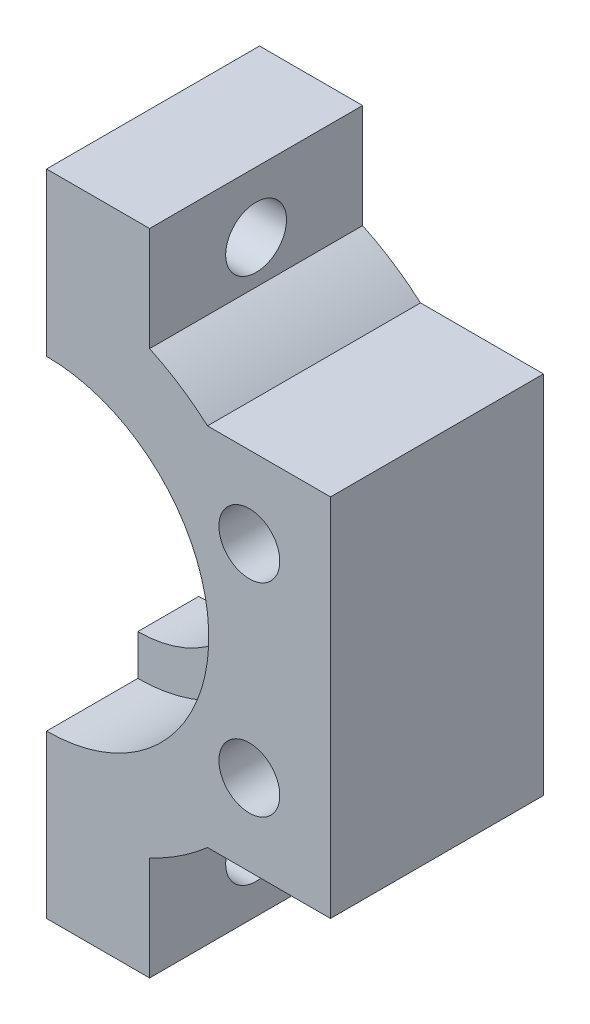
ISO-10303-21;
HEADER;
FILE_DESCRIPTION(('STEP AP214'),'2;1');
FILE_NAME('part.step','',(''),(''),'','','');
FILE_SCHEMA(('AUTOMOTIVE_DESIGN { 1 0 10303 214 1 1 1 1 }'));
ENDSEC;
DATA;
#1=APPLICATION_CONTEXT('core data for automotive mechanical design processes');
#2=APPLICATION_PROTOCOL_DEFINITION('international standard','automotive_design',2000,#1);
#3=PRODUCT_CONTEXT('',#1,'mechanical');
#4=PRODUCT('Part','Part','',(#3));
#5=PRODUCT_RELATED_PRODUCT_CATEGORY('part','',(#4));
#6=PRODUCT_DEFINITION_FORMATION('','',#4);
#7=PRODUCT_DEFINITION_CONTEXT('part definition',#1,'design');
#8=PRODUCT_DEFINITION('design','',#6,#7);
#9=PRODUCT_DEFINITION_SHAPE('','',#8);
#10=(LENGTH_UNIT() NAMED_UNIT(*) SI_UNIT(.MILLI.,.METRE.));
#11=(NAMED_UNIT(*) PLANE_ANGLE_UNIT() SI_UNIT($,.RADIAN.));
#12=(NAMED_UNIT(*) SI_UNIT($,.STERADIAN.) SOLID_ANGLE_UNIT());
#13=UNCERTAINTY_MEASURE_WITH_UNIT(LENGTH_MEASURE(1.E-05),#10,'distance_accuracy_value','');
#14=(GEOMETRIC_REPRESENTATION_CONTEXT(3) GLOBAL_UNCERTAINTY_ASSIGNED_CONTEXT((#13)) GLOBAL_UNIT_ASSIGNED_CONTEXT((#10,
#11,#12)) REPRESENTATION_CONTEXT('',''));
#15=CARTESIAN_POINT('',(0.,0.,0.));
#16=DIRECTION('',(0.,0.,1.));
#17=DIRECTION('',(1.,0.,0.));
#18=AXIS2_PLACEMENT_3D('',#15,#16,#17);
#19=CARTESIAN_POINT('',(0.,0.,10.5));
#20=DIRECTION('',(0.,0.,-1.));
#21=DIRECTION('',(-1.,0.,0.));
#22=AXIS2_PLACEMENT_3D('',#19,#20,#21);
#23=CYLINDRICAL_SURFACE('',#22,6.);
#24=CARTESIAN_POINT('',(0.,0.,3.));
#25=DIRECTION('',(0.,0.,-1.));
#26=DIRECTION('',(-1.,0.,0.));
#27=AXIS2_PLACEMENT_3D('',#24,#25,#26);
#28=CIRCLE('',#27,6.);
#29=CARTESIAN_POINT('',(0.,-6.,3.));
#30=VERTEX_POINT('',#29);
#31=CARTESIAN_POINT('',(0.,6.,3.));
#32=VERTEX_POINT('',#31);
#33=EDGE_CURVE('E243',#30,#32,#28,.F.);
#34=ORIENTED_EDGE('',*,*,#33,.F.);
#35=DIRECTION('',(0.,0.,-1.));
#36=VECTOR('',#35,1.);
#37=CARTESIAN_POINT('',(0.,-6.,10.5));
#38=LINE('',#37,#36);
#39=CARTESIAN_POINT('',(0.,-6.,6.));
#40=VERTEX_POINT('',#39);
#41=EDGE_CURVE('E230',#40,#30,#38,.T.);
#42=ORIENTED_EDGE('',*,*,#41,.F.);
#43=CARTESIAN_POINT('',(0.,0.,6.));
#44=DIRECTION('',(0.,0.,1.));
#45=DIRECTION('',(1.,0.,0.));
#46=AXIS2_PLACEMENT_3D('',#43,#44,#45);
#47=CIRCLE('',#46,6.);
#48=CARTESIAN_POINT('',(0.,6.,6.));
#49=VERTEX_POINT('',#48);
#50=EDGE_CURVE('E60',#49,#40,#47,.F.);
#51=ORIENTED_EDGE('',*,*,#50,.F.);
#52=DIRECTION('',(0.,0.,-1.));
#53=VECTOR('',#52,1.);
#54=CARTESIAN_POINT('',(0.,6.,10.5));
#55=LINE('',#54,#53);
#56=EDGE_CURVE('E233',#49,#32,#55,.T.);
#57=ORIENTED_EDGE('',*,*,#56,.T.);
#58=EDGE_LOOP('',(#34,#42,#51,#57));
#59=FACE_BOUND('',#58,.T.);
#60=ADVANCED_FACE('F37',(#59),#23,.F.);
#61=CARTESIAN_POINT('',(0.,0.,10.5));
#62=DIRECTION('',(0.,0.,1.));
#63=DIRECTION('',(1.,0.,0.));
#64=AXIS2_PLACEMENT_3D('',#61,#62,#63);
#65=PLANE('',#64);
#66=CARTESIAN_POINT('',(0.,0.,10.5));
#67=DIRECTION('',(0.,0.,1.));
#68=DIRECTION('',(1.,0.,0.));
#69=AXIS2_PLACEMENT_3D('',#66,#67,#68);
#70=CIRCLE('',#69,8.);
#71=CARTESIAN_POINT('',(0.,-8.,10.5));
#72=VERTEX_POINT('',#71);
#73=CARTESIAN_POINT('',(0.,8.,10.5));
#74=VERTEX_POINT('',#73);
#75=EDGE_CURVE('E261',#72,#74,#70,.T.);
#76=ORIENTED_EDGE('',*,*,#75,.F.);
#77=DIRECTION('',(0.,-1.,0.));
#78=VECTOR('',#77,1.);
#79=CARTESIAN_POINT('',(0.,-6.,10.5));
#80=LINE('',#79,#78);
#81=CARTESIAN_POINT('',(0.,-16.,10.5));
#82=VERTEX_POINT('',#81);
#83=EDGE_CURVE('E283',#72,#82,#80,.T.);
#84=ORIENTED_EDGE('',*,*,#83,.T.);
#85=DIRECTION('',(1.,0.,0.));
#86=VECTOR('',#85,1.);
#87=CARTESIAN_POINT('',(5.08182667726296,-16.,10.5));
#88=LINE('',#87,#86);
#89=CARTESIAN_POINT('',(5.08182667726296,-16.,10.5));
#90=VERTEX_POINT('',#89);
#91=EDGE_CURVE('E285',#82,#90,#88,.T.);
#92=ORIENTED_EDGE('',*,*,#91,.T.);
#93=DIRECTION('',(0.,1.,0.));
#94=VECTOR('',#93,1.);
#95=CARTESIAN_POINT('',(5.08182667726297,-10.8708342652374,10.5));
#96=LINE('',#95,#94);
#97=CARTESIAN_POINT('',(5.08182667726297,-10.8708342652374,10.5));
#98=VERTEX_POINT('',#97);
#99=EDGE_CURVE('E287',#90,#98,#96,.T.);
#100=ORIENTED_EDGE('',*,*,#99,.T.);
#101=CARTESIAN_POINT('',(0.,0.,10.5));
#102=DIRECTION('',(0.,0.,1.));
#103=DIRECTION('',(1.,0.,0.));
#104=AXIS2_PLACEMENT_3D('',#101,#102,#103);
#105=CIRCLE('',#104,12.);
#106=CARTESIAN_POINT('',(7.93725393319378,-9.,10.5));
#107=VERTEX_POINT('',#106);
#108=EDGE_CURVE('E289',#98,#107,#105,.T.);
#109=ORIENTED_EDGE('',*,*,#108,.T.);
#110=DIRECTION('',(1.,0.,0.));
#111=VECTOR('',#110,1.);
#112=CARTESIAN_POINT('',(14.,-9.,10.5));
#113=LINE('',#112,#111);
#114=CARTESIAN_POINT('',(14.,-9.,10.5));
#115=VERTEX_POINT('',#114);
#116=EDGE_CURVE('E291',#107,#115,#113,.T.);
#117=ORIENTED_EDGE('',*,*,#116,.T.);
#118=DIRECTION('',(0.,1.,0.));
#119=VECTOR('',#118,1.);
#120=CARTESIAN_POINT('',(14.,9.,10.5));
#121=LINE('',#120,#119);
#122=CARTESIAN_POINT('',(14.,9.,10.5));
#123=VERTEX_POINT('',#122);
#124=EDGE_CURVE('E293',#115,#123,#121,.T.);
#125=ORIENTED_EDGE('',*,*,#124,.T.);
#126=DIRECTION('',(-1.,0.,0.));
#127=VECTOR('',#126,1.);
#128=CARTESIAN_POINT('',(7.93725393319378,9.,10.5));
#129=LINE('',#128,#127);
#130=CARTESIAN_POINT('',(7.93725393319378,9.,10.5));
#131=VERTEX_POINT('',#130);
#132=EDGE_CURVE('E295',#123,#131,#129,.T.);
#133=ORIENTED_EDGE('',*,*,#132,.T.);
#134=CARTESIAN_POINT('',(0.,0.,10.5));
#135=DIRECTION('',(0.,0.,1.));
#136=DIRECTION('',(1.,0.,0.));
#137=AXIS2_PLACEMENT_3D('',#134,#135,#136);
#138=CIRCLE('',#137,12.);
#139=CARTESIAN_POINT('',(5.08182667726297,10.8708342652373,10.5));
#140=VERTEX_POINT('',#139);
#141=EDGE_CURVE('E297',#131,#140,#138,.T.);
#142=ORIENTED_EDGE('',*,*,#141,.T.);
#143=DIRECTION('',(0.,1.,0.));
#144=VECTOR('',#143,1.);
#145=CARTESIAN_POINT('',(5.08182667726296,16.,10.5));
#146=LINE('',#145,#144);
#147=CARTESIAN_POINT('',(5.08182667726296,16.,10.5));
#148=VERTEX_POINT('',#147);
#149=EDGE_CURVE('E298',#140,#148,#146,.T.);
#150=ORIENTED_EDGE('',*,*,#149,.T.);
#151=DIRECTION('',(-1.,0.,0.));
#152=VECTOR('',#151,1.);
#153=CARTESIAN_POINT('',(0.,16.,10.5));
#154=LINE('',#153,#152);
#155=CARTESIAN_POINT('',(0.,16.,10.5));
#156=VERTEX_POINT('',#155);
#157=EDGE_CURVE('E181',#148,#156,#154,.T.);
#158=ORIENTED_EDGE('',*,*,#157,.T.);
#159=DIRECTION('',(0.,-1.,0.));
#160=VECTOR('',#159,1.);
#161=CARTESIAN_POINT('',(0.,9.,10.5));
#162=LINE('',#161,#160);
#163=EDGE_CURVE('E201',#156,#74,#162,.T.);
#164=ORIENTED_EDGE('',*,*,#163,.T.);
#165=EDGE_LOOP('',(#76,#84,#92,#100,#109,#117,#125,#133,#142,#150,#158,#164));
#166=FACE_BOUND('',#165,.T.);
#167=CARTESIAN_POINT('',(10.,5.,10.5));
#168=DIRECTION('',(0.,0.,1.));
#169=DIRECTION('',(1.,0.,0.));
#170=AXIS2_PLACEMENT_3D('',#167,#168,#169);
#171=CIRCLE('',#170,1.5);
#172=CARTESIAN_POINT('',(8.5,5.,10.5));
#173=VERTEX_POINT('',#172);
#174=EDGE_CURVE('E173',#173,#173,#171,.T.);
#175=ORIENTED_EDGE('',*,*,#174,.F.);
#176=EDGE_LOOP('',(#175));
#177=FACE_BOUND('',#176,.T.);
#178=CARTESIAN_POINT('',(10.,-5.,10.5));
#179=DIRECTION('',(0.,0.,1.));
#180=DIRECTION('',(1.,0.,0.));
#181=AXIS2_PLACEMENT_3D('',#178,#179,#180);
#182=CIRCLE('',#181,1.5);
#183=CARTESIAN_POINT('',(8.5,-5.,10.5));
#184=VERTEX_POINT('',#183);
#185=EDGE_CURVE('E274',#184,#184,#182,.T.);
#186=ORIENTED_EDGE('',*,*,#185,.F.);
#187=EDGE_LOOP('',(#186));
#188=FACE_BOUND('',#187,.T.);
#189=ADVANCED_FACE('F303',(#166,#177,#188),#65,.T.);
#190=CARTESIAN_POINT('',(0.,0.,0.));
#191=DIRECTION('',(0.,0.,1.));
#192=DIRECTION('',(1.,0.,0.));
#193=AXIS2_PLACEMENT_3D('',#190,#191,#192);
#194=PLANE('',#193);
#195=DIRECTION('',(0.,-1.,0.));
#196=VECTOR('',#195,1.);
#197=CARTESIAN_POINT('',(0.,-16.,0.));
#198=LINE('',#197,#196);
#199=CARTESIAN_POINT('',(0.,-8.,0.));
#200=VERTEX_POINT('',#199);
#201=CARTESIAN_POINT('',(0.,-16.,0.));
#202=VERTEX_POINT('',#201);
#203=EDGE_CURVE('E167',#200,#202,#198,.T.);
#204=ORIENTED_EDGE('',*,*,#203,.F.);
#205=CARTESIAN_POINT('',(0.,0.,0.));
#206=DIRECTION('',(0.,0.,-1.));
#207=DIRECTION('',(-1.,0.,0.));
#208=AXIS2_PLACEMENT_3D('',#205,#206,#207);
#209=CIRCLE('',#208,8.);
#210=CARTESIAN_POINT('',(0.,8.,0.));
#211=VERTEX_POINT('',#210);
#212=EDGE_CURVE('E152',#211,#200,#209,.T.);
#213=ORIENTED_EDGE('',*,*,#212,.F.);
#214=DIRECTION('',(0.,-1.,0.));
#215=VECTOR('',#214,1.);
#216=CARTESIAN_POINT('',(0.,9.,0.));
#217=LINE('',#216,#215);
#218=CARTESIAN_POINT('',(0.,16.,0.));
#219=VERTEX_POINT('',#218);
#220=EDGE_CURVE('E164',#219,#211,#217,.T.);
#221=ORIENTED_EDGE('',*,*,#220,.F.);
#222=DIRECTION('',(-1.,0.,0.));
#223=VECTOR('',#222,1.);
#224=CARTESIAN_POINT('',(0.,16.,0.));
#225=LINE('',#224,#223);
#226=CARTESIAN_POINT('',(5.08182667726296,16.,0.));
#227=VERTEX_POINT('',#226);
#228=EDGE_CURVE('E199',#227,#219,#225,.T.);
#229=ORIENTED_EDGE('',*,*,#228,.F.);
#230=DIRECTION('',(0.,1.,0.));
#231=VECTOR('',#230,1.);
#232=CARTESIAN_POINT('',(5.08182667726296,16.,0.));
#233=LINE('',#232,#231);
#234=CARTESIAN_POINT('',(5.08182667726297,10.8708342652373,0.));
#235=VERTEX_POINT('',#234);
#236=EDGE_CURVE('E197',#235,#227,#233,.T.);
#237=ORIENTED_EDGE('',*,*,#236,.F.);
#238=CARTESIAN_POINT('',(0.,0.,0.));
#239=DIRECTION('',(0.,0.,1.));
#240=DIRECTION('',(1.,0.,0.));
#241=AXIS2_PLACEMENT_3D('',#238,#239,#240);
#242=CIRCLE('',#241,12.);
#243=CARTESIAN_POINT('',(7.93725393319378,9.,0.));
#244=VERTEX_POINT('',#243);
#245=EDGE_CURVE('E195',#244,#235,#242,.T.);
#246=ORIENTED_EDGE('',*,*,#245,.F.);
#247=DIRECTION('',(-1.,0.,0.));
#248=VECTOR('',#247,1.);
#249=CARTESIAN_POINT('',(7.93725393319378,9.,0.));
#250=LINE('',#249,#248);
#251=CARTESIAN_POINT('',(14.,9.,0.));
#252=VERTEX_POINT('',#251);
#253=EDGE_CURVE('E193',#252,#244,#250,.T.);
#254=ORIENTED_EDGE('',*,*,#253,.F.);
#255=DIRECTION('',(0.,1.,0.));
#256=VECTOR('',#255,1.);
#257=CARTESIAN_POINT('',(14.,9.,0.));
#258=LINE('',#257,#256);
#259=CARTESIAN_POINT('',(14.,-9.,0.));
#260=VERTEX_POINT('',#259);
#261=EDGE_CURVE('E191',#260,#252,#258,.T.);
#262=ORIENTED_EDGE('',*,*,#261,.F.);
#263=DIRECTION('',(1.,0.,0.));
#264=VECTOR('',#263,1.);
#265=CARTESIAN_POINT('',(14.,-9.,0.));
#266=LINE('',#265,#264);
#267=CARTESIAN_POINT('',(7.93725393319378,-9.,0.));
#268=VERTEX_POINT('',#267);
#269=EDGE_CURVE('E189',#268,#260,#266,.T.);
#270=ORIENTED_EDGE('',*,*,#269,.F.);
#271=CARTESIAN_POINT('',(0.,0.,0.));
#272=DIRECTION('',(0.,0.,1.));
#273=DIRECTION('',(1.,0.,0.));
#274=AXIS2_PLACEMENT_3D('',#271,#272,#273);
#275=CIRCLE('',#274,12.);
#276=CARTESIAN_POINT('',(5.08182667726297,-10.8708342652374,0.));
#277=VERTEX_POINT('',#276);
#278=EDGE_CURVE('E187',#277,#268,#275,.T.);
#279=ORIENTED_EDGE('',*,*,#278,.F.);
#280=DIRECTION('',(0.,1.,0.));
#281=VECTOR('',#280,1.);
#282=CARTESIAN_POINT('',(5.08182667726297,-10.8708342652374,0.));
#283=LINE('',#282,#281);
#284=CARTESIAN_POINT('',(5.08182667726296,-16.,0.));
#285=VERTEX_POINT('',#284);
#286=EDGE_CURVE('E185',#285,#277,#283,.T.);
#287=ORIENTED_EDGE('',*,*,#286,.F.);
#288=DIRECTION('',(1.,0.,0.));
#289=VECTOR('',#288,1.);
#290=CARTESIAN_POINT('',(5.08182667726296,-16.,0.));
#291=LINE('',#290,#289);
#292=EDGE_CURVE('E175',#202,#285,#291,.T.);
#293=ORIENTED_EDGE('',*,*,#292,.F.);
#294=EDGE_LOOP('',(#204,#213,#221,#229,#237,#246,#254,#262,#270,#279,#287,#293));
#295=FACE_BOUND('',#294,.T.);
#296=CARTESIAN_POINT('',(10.,5.,0.));
#297=DIRECTION('',(0.,0.,1.));
#298=DIRECTION('',(1.,0.,0.));
#299=AXIS2_PLACEMENT_3D('',#296,#297,#298);
#300=CIRCLE('',#299,1.5);
#301=CARTESIAN_POINT('',(8.5,5.,0.));
#302=VERTEX_POINT('',#301);
#303=EDGE_CURVE('E178',#302,#302,#300,.T.);
#304=ORIENTED_EDGE('',*,*,#303,.T.);
#305=EDGE_LOOP('',(#304));
#306=FACE_BOUND('',#305,.T.);
#307=CARTESIAN_POINT('',(10.,-5.,0.));
#308=DIRECTION('',(0.,0.,1.));
#309=DIRECTION('',(1.,0.,0.));
#310=AXIS2_PLACEMENT_3D('',#307,#308,#309);
#311=CIRCLE('',#310,1.5);
#312=CARTESIAN_POINT('',(8.5,-5.,0.));
#313=VERTEX_POINT('',#312);
#314=EDGE_CURVE('E273',#313,#313,#311,.T.);
#315=ORIENTED_EDGE('',*,*,#314,.T.);
#316=EDGE_LOOP('',(#315));
#317=FACE_BOUND('',#316,.T.);
#318=ADVANCED_FACE('F161',(#295,#306,#317),#194,.F.);
#319=CARTESIAN_POINT('',(0.,9.,10.5));
#320=DIRECTION('',(1.,0.,0.));
#321=DIRECTION('',(0.,1.,0.));
#322=AXIS2_PLACEMENT_3D('',#319,#320,#321);
#323=PLANE('',#322);
#324=CARTESIAN_POINT('',(0.,13.,5.25));
#325=DIRECTION('',(1.,0.,0.));
#326=DIRECTION('',(0.,1.,0.));
#327=AXIS2_PLACEMENT_3D('',#324,#325,#326);
#328=CIRCLE('',#327,1.5);
#329=CARTESIAN_POINT('',(0.,14.5,5.25));
#330=VERTEX_POINT('',#329);
#331=EDGE_CURVE('E265',#330,#330,#328,.T.);
#332=ORIENTED_EDGE('',*,*,#331,.T.);
#333=EDGE_LOOP('',(#332));
#334=FACE_BOUND('',#333,.T.);
#335=ORIENTED_EDGE('',*,*,#220,.T.);
#336=DIRECTION('',(0.,0.,-1.));
#337=VECTOR('',#336,1.);
#338=CARTESIAN_POINT('',(0.,8.,3.));
#339=LINE('',#338,#337);
#340=CARTESIAN_POINT('',(0.,8.,3.));
#341=VERTEX_POINT('',#340);
#342=EDGE_CURVE('E149',#211,#341,#339,.F.);
#343=ORIENTED_EDGE('',*,*,#342,.T.);
#344=DIRECTION('',(0.,1.,0.));
#345=VECTOR('',#344,1.);
#346=CARTESIAN_POINT('',(0.,9.,3.));
#347=LINE('',#346,#345);
#348=EDGE_CURVE('E157',#32,#341,#347,.T.);
#349=ORIENTED_EDGE('',*,*,#348,.F.);
#350=ORIENTED_EDGE('',*,*,#56,.F.);
#351=DIRECTION('',(0.,-1.,0.));
#352=VECTOR('',#351,1.);
#353=CARTESIAN_POINT('',(0.,9.,6.));
#354=LINE('',#353,#352);
#355=CARTESIAN_POINT('',(0.,8.,6.));
#356=VERTEX_POINT('',#355);
#357=EDGE_CURVE('E263',#356,#49,#354,.T.);
#358=ORIENTED_EDGE('',*,*,#357,.F.);
#359=DIRECTION('',(0.,0.,1.));
#360=VECTOR('',#359,1.);
#361=CARTESIAN_POINT('',(0.,8.,6.));
#362=LINE('',#361,#360);
#363=EDGE_CURVE('E260',#356,#74,#362,.T.);
#364=ORIENTED_EDGE('',*,*,#363,.T.);
#365=ORIENTED_EDGE('',*,*,#163,.F.);
#366=DIRECTION('',(0.,0.,-1.));
#367=VECTOR('',#366,1.);
#368=CARTESIAN_POINT('',(0.,16.,10.5));
#369=LINE('',#368,#367);
#370=EDGE_CURVE('E172',#156,#219,#369,.T.);
#371=ORIENTED_EDGE('',*,*,#370,.T.);
#372=EDGE_LOOP('',(#335,#343,#349,#350,#358,#364,#365,#371));
#373=FACE_BOUND('',#372,.T.);
#374=ADVANCED_FACE('F39',(#334,#373),#323,.F.);
#375=CARTESIAN_POINT('',(0.,-16.,10.5));
#376=DIRECTION('',(1.,0.,0.));
#377=DIRECTION('',(0.,0.,-1.));
#378=AXIS2_PLACEMENT_3D('',#375,#376,#377);
#379=PLANE('',#378);
#380=CARTESIAN_POINT('',(0.,-13.,5.25));
#381=DIRECTION('',(1.,0.,0.));
#382=DIRECTION('',(0.,1.,0.));
#383=AXIS2_PLACEMENT_3D('',#380,#381,#382);
#384=CIRCLE('',#383,1.5);
#385=CARTESIAN_POINT('',(0.,-11.5,5.25));
#386=VERTEX_POINT('',#385);
#387=EDGE_CURVE('E309',#386,#386,#384,.T.);
#388=ORIENTED_EDGE('',*,*,#387,.T.);
#389=EDGE_LOOP('',(#388));
#390=FACE_BOUND('',#389,.T.);
#391=DIRECTION('',(0.,1.,0.));
#392=VECTOR('',#391,1.);
#393=CARTESIAN_POINT('',(0.,-16.,3.));
#394=LINE('',#393,#392);
#395=CARTESIAN_POINT('',(0.,-8.,3.));
#396=VERTEX_POINT('',#395);
#397=EDGE_CURVE('E45',#396,#30,#394,.T.);
#398=ORIENTED_EDGE('',*,*,#397,.F.);
#399=DIRECTION('',(0.,0.,-1.));
#400=VECTOR('',#399,1.);
#401=CARTESIAN_POINT('',(0.,-8.,3.));
#402=LINE('',#401,#400);
#403=EDGE_CURVE('E11',#396,#200,#402,.T.);
#404=ORIENTED_EDGE('',*,*,#403,.T.);
#405=ORIENTED_EDGE('',*,*,#203,.T.);
#406=DIRECTION('',(0.,0.,-1.));
#407=VECTOR('',#406,1.);
#408=CARTESIAN_POINT('',(0.,-16.,10.5));
#409=LINE('',#408,#407);
#410=EDGE_CURVE('E227',#82,#202,#409,.T.);
#411=ORIENTED_EDGE('',*,*,#410,.F.);
#412=ORIENTED_EDGE('',*,*,#83,.F.);
#413=DIRECTION('',(0.,0.,1.));
#414=VECTOR('',#413,1.);
#415=CARTESIAN_POINT('',(0.,-8.,6.));
#416=LINE('',#415,#414);
#417=CARTESIAN_POINT('',(0.,-8.,6.));
#418=VERTEX_POINT('',#417);
#419=EDGE_CURVE('E238',#72,#418,#416,.F.);
#420=ORIENTED_EDGE('',*,*,#419,.T.);
#421=DIRECTION('',(0.,-1.,0.));
#422=VECTOR('',#421,1.);
#423=CARTESIAN_POINT('',(0.,-16.,6.));
#424=LINE('',#423,#422);
#425=EDGE_CURVE('E236',#40,#418,#424,.T.);
#426=ORIENTED_EDGE('',*,*,#425,.F.);
#427=ORIENTED_EDGE('',*,*,#41,.T.);
#428=EDGE_LOOP('',(#398,#404,#405,#411,#412,#420,#426,#427));
#429=FACE_BOUND('',#428,.T.);
#430=ADVANCED_FACE('F249',(#390,#429),#379,.F.);
#431=CARTESIAN_POINT('',(5.08182667726296,-16.,10.5));
#432=DIRECTION('',(0.,1.,0.));
#433=DIRECTION('',(0.,0.,1.));
#434=AXIS2_PLACEMENT_3D('',#431,#432,#433);
#435=PLANE('',#434);
#436=ORIENTED_EDGE('',*,*,#292,.T.);
#437=DIRECTION('',(0.,0.,-1.));
#438=VECTOR('',#437,1.);
#439=CARTESIAN_POINT('',(5.08182667726296,-16.,10.5));
#440=LINE('',#439,#438);
#441=EDGE_CURVE('E224',#90,#285,#440,.T.);
#442=ORIENTED_EDGE('',*,*,#441,.F.);
#443=ORIENTED_EDGE('',*,*,#91,.F.);
#444=ORIENTED_EDGE('',*,*,#410,.T.);
#445=EDGE_LOOP('',(#436,#442,#443,#444));
#446=FACE_BOUND('',#445,.T.);
#447=ADVANCED_FACE('F358',(#446),#435,.F.);
#448=CARTESIAN_POINT('',(5.08182667726297,-10.8708342652374,10.5));
#449=DIRECTION('',(-1.,0.,0.));
#450=DIRECTION('',(0.,-1.,0.));
#451=AXIS2_PLACEMENT_3D('',#448,#449,#450);
#452=PLANE('',#451);
#453=CARTESIAN_POINT('',(5.081826677263,-13.,5.25));
#454=DIRECTION('',(1.,0.,0.));
#455=DIRECTION('',(0.,1.,0.));
#456=AXIS2_PLACEMENT_3D('',#453,#454,#455);
#457=CIRCLE('',#456,1.5);
#458=CARTESIAN_POINT('',(5.081826677263,-11.5,5.25));
#459=VERTEX_POINT('',#458);
#460=EDGE_CURVE('E156',#459,#459,#457,.T.);
#461=ORIENTED_EDGE('',*,*,#460,.F.);
#462=EDGE_LOOP('',(#461));
#463=FACE_BOUND('',#462,.T.);
#464=ORIENTED_EDGE('',*,*,#286,.T.);
#465=DIRECTION('',(0.,0.,-1.));
#466=VECTOR('',#465,1.);
#467=CARTESIAN_POINT('',(5.08182667726297,-10.8708342652374,10.5));
#468=LINE('',#467,#466);
#469=EDGE_CURVE('E221',#98,#277,#468,.T.);
#470=ORIENTED_EDGE('',*,*,#469,.F.);
#471=ORIENTED_EDGE('',*,*,#99,.F.);
#472=ORIENTED_EDGE('',*,*,#441,.T.);
#473=EDGE_LOOP('',(#464,#470,#471,#472));
#474=FACE_BOUND('',#473,.T.);
#475=ADVANCED_FACE('F355',(#463,#474),#452,.F.);
#476=CARTESIAN_POINT('',(0.,0.,10.5));
#477=DIRECTION('',(0.,0.,-1.));
#478=DIRECTION('',(-1.,0.,0.));
#479=AXIS2_PLACEMENT_3D('',#476,#477,#478);
#480=CYLINDRICAL_SURFACE('',#479,12.);
#481=ORIENTED_EDGE('',*,*,#278,.T.);
#482=DIRECTION('',(0.,0.,-1.));
#483=VECTOR('',#482,1.);
#484=CARTESIAN_POINT('',(7.93725393319378,-9.,10.5));
#485=LINE('',#484,#483);
#486=EDGE_CURVE('E218',#107,#268,#485,.T.);
#487=ORIENTED_EDGE('',*,*,#486,.F.);
#488=ORIENTED_EDGE('',*,*,#108,.F.);
#489=ORIENTED_EDGE('',*,*,#469,.T.);
#490=EDGE_LOOP('',(#481,#487,#488,#489));
#491=FACE_BOUND('',#490,.T.);
#492=ADVANCED_FACE('F351',(#491),#480,.T.);
#493=CARTESIAN_POINT('',(14.,-9.,10.5));
#494=DIRECTION('',(0.,1.,0.));
#495=DIRECTION('',(0.,0.,1.));
#496=AXIS2_PLACEMENT_3D('',#493,#494,#495);
#497=PLANE('',#496);
#498=ORIENTED_EDGE('',*,*,#269,.T.);
#499=DIRECTION('',(0.,0.,-1.));
#500=VECTOR('',#499,1.);
#501=CARTESIAN_POINT('',(14.,-9.,10.5));
#502=LINE('',#501,#500);
#503=EDGE_CURVE('E215',#115,#260,#502,.T.);
#504=ORIENTED_EDGE('',*,*,#503,.F.);
#505=ORIENTED_EDGE('',*,*,#116,.F.);
#506=ORIENTED_EDGE('',*,*,#486,.T.);
#507=EDGE_LOOP('',(#498,#504,#505,#506));
#508=FACE_BOUND('',#507,.T.);
#509=ADVANCED_FACE('F346',(#508),#497,.F.);
#510=CARTESIAN_POINT('',(14.,9.,10.5));
#511=DIRECTION('',(-1.,0.,0.));
#512=DIRECTION('',(0.,0.,1.));
#513=AXIS2_PLACEMENT_3D('',#510,#511,#512);
#514=PLANE('',#513);
#515=ORIENTED_EDGE('',*,*,#261,.T.);
#516=DIRECTION('',(0.,0.,-1.));
#517=VECTOR('',#516,1.);
#518=CARTESIAN_POINT('',(14.,9.,10.5));
#519=LINE('',#518,#517);
#520=EDGE_CURVE('E212',#123,#252,#519,.T.);
#521=ORIENTED_EDGE('',*,*,#520,.F.);
#522=ORIENTED_EDGE('',*,*,#124,.F.);
#523=ORIENTED_EDGE('',*,*,#503,.T.);
#524=EDGE_LOOP('',(#515,#521,#522,#523));
#525=FACE_BOUND('',#524,.T.);
#526=ADVANCED_FACE('F340',(#525),#514,.F.);
#527=CARTESIAN_POINT('',(7.93725393319378,9.,10.5));
#528=DIRECTION('',(0.,-1.,0.));
#529=DIRECTION('',(0.,0.,-1.));
#530=AXIS2_PLACEMENT_3D('',#527,#528,#529);
#531=PLANE('',#530);
#532=ORIENTED_EDGE('',*,*,#253,.T.);
#533=DIRECTION('',(0.,0.,-1.));
#534=VECTOR('',#533,1.);
#535=CARTESIAN_POINT('',(7.93725393319378,9.,10.5));
#536=LINE('',#535,#534);
#537=EDGE_CURVE('E209',#131,#244,#536,.T.);
#538=ORIENTED_EDGE('',*,*,#537,.F.);
#539=ORIENTED_EDGE('',*,*,#132,.F.);
#540=ORIENTED_EDGE('',*,*,#520,.T.);
#541=EDGE_LOOP('',(#532,#538,#539,#540));
#542=FACE_BOUND('',#541,.T.);
#543=ADVANCED_FACE('F336',(#542),#531,.F.);
#544=CARTESIAN_POINT('',(0.,0.,10.5));
#545=DIRECTION('',(0.,0.,-1.));
#546=DIRECTION('',(-1.,0.,0.));
#547=AXIS2_PLACEMENT_3D('',#544,#545,#546);
#548=CYLINDRICAL_SURFACE('',#547,12.);
#549=ORIENTED_EDGE('',*,*,#245,.T.);
#550=DIRECTION('',(0.,0.,-1.));
#551=VECTOR('',#550,1.);
#552=CARTESIAN_POINT('',(5.08182667726297,10.8708342652373,10.5));
#553=LINE('',#552,#551);
#554=EDGE_CURVE('E206',#140,#235,#553,.T.);
#555=ORIENTED_EDGE('',*,*,#554,.F.);
#556=ORIENTED_EDGE('',*,*,#141,.F.);
#557=ORIENTED_EDGE('',*,*,#537,.T.);
#558=EDGE_LOOP('',(#549,#555,#556,#557));
#559=FACE_BOUND('',#558,.T.);
#560=ADVANCED_FACE('F324',(#559),#548,.T.);
#561=CARTESIAN_POINT('',(5.08182667726296,16.,10.5));
#562=DIRECTION('',(-1.,0.,0.));
#563=DIRECTION('',(0.,-1.,0.));
#564=AXIS2_PLACEMENT_3D('',#561,#562,#563);
#565=PLANE('',#564);
#566=CARTESIAN_POINT('',(5.08182667726296,13.,5.25));
#567=DIRECTION('',(1.,0.,0.));
#568=DIRECTION('',(0.,1.,0.));
#569=AXIS2_PLACEMENT_3D('',#566,#567,#568);
#570=CIRCLE('',#569,1.5);
#571=CARTESIAN_POINT('',(5.08182667726296,14.5,5.25));
#572=VERTEX_POINT('',#571);
#573=EDGE_CURVE('E268',#572,#572,#570,.T.);
#574=ORIENTED_EDGE('',*,*,#573,.F.);
#575=EDGE_LOOP('',(#574));
#576=FACE_BOUND('',#575,.T.);
#577=ORIENTED_EDGE('',*,*,#236,.T.);
#578=DIRECTION('',(0.,0.,-1.));
#579=VECTOR('',#578,1.);
#580=CARTESIAN_POINT('',(5.08182667726296,16.,10.5));
#581=LINE('',#580,#579);
#582=EDGE_CURVE('E203',#148,#227,#581,.T.);
#583=ORIENTED_EDGE('',*,*,#582,.F.);
#584=ORIENTED_EDGE('',*,*,#149,.F.);
#585=ORIENTED_EDGE('',*,*,#554,.T.);
#586=EDGE_LOOP('',(#577,#583,#584,#585));
#587=FACE_BOUND('',#586,.T.);
#588=ADVANCED_FACE('F321',(#576,#587),#565,.F.);
#589=CARTESIAN_POINT('',(0.,16.,10.5));
#590=DIRECTION('',(0.,-1.,0.));
#591=DIRECTION('',(0.,0.,-1.));
#592=AXIS2_PLACEMENT_3D('',#589,#590,#591);
#593=PLANE('',#592);
#594=ORIENTED_EDGE('',*,*,#228,.T.);
#595=ORIENTED_EDGE('',*,*,#370,.F.);
#596=ORIENTED_EDGE('',*,*,#157,.F.);
#597=ORIENTED_EDGE('',*,*,#582,.T.);
#598=EDGE_LOOP('',(#594,#595,#596,#597));
#599=FACE_BOUND('',#598,.T.);
#600=ADVANCED_FACE('F306',(#599),#593,.F.);
#601=CARTESIAN_POINT('',(10.,5.,10.5));
#602=DIRECTION('',(0.,0.,-1.));
#603=DIRECTION('',(-1.,0.,0.));
#604=AXIS2_PLACEMENT_3D('',#601,#602,#603);
#605=CYLINDRICAL_SURFACE('',#604,1.5);
#606=CARTESIAN_POINT('',(8.5,5.,10.5));
#607=CARTESIAN_POINT('',(8.5,5.,10.390625));
#608=CARTESIAN_POINT('',(8.5,5.,10.28125));
#609=CARTESIAN_POINT('',(8.5,5.,10.0625));
#610=CARTESIAN_POINT('',(8.5,5.,9.953125));
#611=CARTESIAN_POINT('',(8.5,5.,9.734375));
#612=CARTESIAN_POINT('',(8.5,5.,9.625));
#613=CARTESIAN_POINT('',(8.5,5.,9.40625));
#614=CARTESIAN_POINT('',(8.5,5.,9.296875));
#615=CARTESIAN_POINT('',(8.5,5.,9.078125));
#616=CARTESIAN_POINT('',(8.5,5.,8.96875));
#617=CARTESIAN_POINT('',(8.5,5.,8.75));
#618=CARTESIAN_POINT('',(8.5,5.,8.640625));
#619=CARTESIAN_POINT('',(8.5,5.,8.421875));
#620=CARTESIAN_POINT('',(8.5,5.,8.3125));
#621=CARTESIAN_POINT('',(8.5,5.,8.09375));
#622=CARTESIAN_POINT('',(8.5,5.,7.984375));
#623=CARTESIAN_POINT('',(8.5,5.,7.765625));
#624=CARTESIAN_POINT('',(8.5,5.,7.65625));
#625=CARTESIAN_POINT('',(8.5,5.,7.4375));
#626=CARTESIAN_POINT('',(8.5,5.,7.328125));
#627=CARTESIAN_POINT('',(8.5,5.,7.109375));
#628=CARTESIAN_POINT('',(8.5,5.,7.));
#629=CARTESIAN_POINT('',(8.5,5.,6.78125));
#630=CARTESIAN_POINT('',(8.5,5.,6.671875));
#631=CARTESIAN_POINT('',(8.5,5.,6.453125));
#632=CARTESIAN_POINT('',(8.5,5.,6.34375));
#633=CARTESIAN_POINT('',(8.5,5.,6.125));
#634=CARTESIAN_POINT('',(8.5,5.,6.015625));
#635=CARTESIAN_POINT('',(8.5,5.,5.796875));
#636=CARTESIAN_POINT('',(8.5,5.,5.6875));
#637=CARTESIAN_POINT('',(8.5,5.,5.46875));
#638=CARTESIAN_POINT('',(8.5,5.,5.359375));
#639=CARTESIAN_POINT('',(8.5,5.,5.140625));
#640=CARTESIAN_POINT('',(8.5,5.,5.03125));
#641=CARTESIAN_POINT('',(8.5,5.,4.8125));
#642=CARTESIAN_POINT('',(8.5,5.,4.703125));
#643=CARTESIAN_POINT('',(8.5,5.,4.484375));
#644=CARTESIAN_POINT('',(8.5,5.,4.375));
#645=CARTESIAN_POINT('',(8.5,5.,4.15625));
#646=CARTESIAN_POINT('',(8.5,5.,4.046875));
#647=CARTESIAN_POINT('',(8.5,5.,3.828125));
#648=CARTESIAN_POINT('',(8.5,5.,3.71875));
#649=CARTESIAN_POINT('',(8.5,5.,3.5));
#650=CARTESIAN_POINT('',(8.5,5.,3.390625));
#651=CARTESIAN_POINT('',(8.5,5.,3.171875));
#652=CARTESIAN_POINT('',(8.5,5.,3.0625));
#653=CARTESIAN_POINT('',(8.5,5.,2.84375));
#654=CARTESIAN_POINT('',(8.5,5.,2.734375));
#655=CARTESIAN_POINT('',(8.5,5.,2.515625));
#656=CARTESIAN_POINT('',(8.5,5.,2.40625));
#657=CARTESIAN_POINT('',(8.5,5.,2.1875));
#658=CARTESIAN_POINT('',(8.5,5.,2.078125));
#659=CARTESIAN_POINT('',(8.5,5.,1.859375));
#660=CARTESIAN_POINT('',(8.5,5.,1.75));
#661=CARTESIAN_POINT('',(8.5,5.,1.53125));
#662=CARTESIAN_POINT('',(8.5,5.,1.421875));
#663=CARTESIAN_POINT('',(8.5,5.,1.203125));
#664=CARTESIAN_POINT('',(8.5,5.,1.09375));
#665=CARTESIAN_POINT('',(8.5,5.,0.875000000000001));
#666=CARTESIAN_POINT('',(8.5,5.,0.765625000000001));
#667=CARTESIAN_POINT('',(8.5,5.,0.546875));
#668=CARTESIAN_POINT('',(8.5,5.,0.4375));
#669=CARTESIAN_POINT('',(8.5,5.,0.21875));
#670=CARTESIAN_POINT('',(8.5,5.,0.109375));
#671=CARTESIAN_POINT('',(8.5,5.,0.));
#672=B_SPLINE_CURVE_WITH_KNOTS('',3,(#606,#607,#608,#609,#610,#611,#612,#613,#614,#615,#616,
#617,#618,#619,#620,#621,#622,#623,#624,#625,#626,#627,#628,#629,#630,#631,#632,#633,#634,#635,
#636,#637,#638,#639,#640,#641,#642,#643,#644,#645,#646,#647,#648,#649,#650,#651,#652,#653,#654,
#655,#656,#657,#658,#659,#660,#661,#662,#663,#664,#665,#666,#667,#668,#669,#670,#671),
.UNSPECIFIED.,.F.,.F.,(4,2,2,2,2,2,2,2,2,2,2,2,2,2,2,2,2,2,2,2,2,2,2,2,2,2,2,2,2,2,2,2,4),(0.,
0.328124999999999,0.656249999999999,0.984374999999999,1.3125,1.640625,1.96875,2.296875,2.625,
2.953125,3.28125,3.609375,3.9375,4.265625,4.59375,4.921875,5.25,5.578125,5.90625,6.234375,
6.5625,6.890625,7.21875,7.546875,7.875,8.203125,8.53125,8.859375,9.1875,9.515625,9.84375,
10.171875,10.5),.UNSPECIFIED.);
#673=EDGE_CURVE('BSEAM381',#173,#302,#672,.T.);
#674=ORIENTED_EDGE('',*,*,#174,.T.);
#675=ORIENTED_EDGE('',*,*,#303,.F.);
#676=ORIENTED_EDGE('',*,*,#673,.T.);
#677=ORIENTED_EDGE('',*,*,#673,.F.);
#678=EDGE_LOOP('',(#674,#676,#675,#677));
#679=FACE_BOUND('',#678,.T.);
#680=ADVANCED_FACE('F381',(#679),#605,.F.);
#681=CARTESIAN_POINT('',(10.,-5.,10.5));
#682=DIRECTION('',(0.,0.,-1.));
#683=DIRECTION('',(-1.,0.,0.));
#684=AXIS2_PLACEMENT_3D('',#681,#682,#683);
#685=CYLINDRICAL_SURFACE('',#684,1.5);
#686=CARTESIAN_POINT('',(8.5,-5.,10.5));
#687=CARTESIAN_POINT('',(8.5,-5.,10.390625));
#688=CARTESIAN_POINT('',(8.5,-5.,10.28125));
#689=CARTESIAN_POINT('',(8.5,-5.,10.0625));
#690=CARTESIAN_POINT('',(8.5,-5.,9.953125));
#691=CARTESIAN_POINT('',(8.5,-5.,9.734375));
#692=CARTESIAN_POINT('',(8.5,-5.,9.625));
#693=CARTESIAN_POINT('',(8.5,-5.,9.40625));
#694=CARTESIAN_POINT('',(8.5,-5.,9.296875));
#695=CARTESIAN_POINT('',(8.5,-5.,9.078125));
#696=CARTESIAN_POINT('',(8.5,-5.,8.96875));
#697=CARTESIAN_POINT('',(8.5,-5.,8.75));
#698=CARTESIAN_POINT('',(8.5,-5.,8.640625));
#699=CARTESIAN_POINT('',(8.5,-5.,8.421875));
#700=CARTESIAN_POINT('',(8.5,-5.,8.3125));
#701=CARTESIAN_POINT('',(8.5,-5.,8.09375));
#702=CARTESIAN_POINT('',(8.5,-5.,7.984375));
#703=CARTESIAN_POINT('',(8.5,-5.,7.765625));
#704=CARTESIAN_POINT('',(8.5,-5.,7.65625));
#705=CARTESIAN_POINT('',(8.5,-5.,7.4375));
#706=CARTESIAN_POINT('',(8.5,-5.,7.328125));
#707=CARTESIAN_POINT('',(8.5,-5.,7.109375));
#708=CARTESIAN_POINT('',(8.5,-5.,7.));
#709=CARTESIAN_POINT('',(8.5,-5.,6.78125));
#710=CARTESIAN_POINT('',(8.5,-5.,6.671875));
#711=CARTESIAN_POINT('',(8.5,-5.,6.453125));
#712=CARTESIAN_POINT('',(8.5,-5.,6.34375));
#713=CARTESIAN_POINT('',(8.5,-5.,6.125));
#714=CARTESIAN_POINT('',(8.5,-5.,6.015625));
#715=CARTESIAN_POINT('',(8.5,-5.,5.796875));
#716=CARTESIAN_POINT('',(8.5,-5.,5.6875));
#717=CARTESIAN_POINT('',(8.5,-5.,5.46875));
#718=CARTESIAN_POINT('',(8.5,-5.,5.359375));
#719=CARTESIAN_POINT('',(8.5,-5.,5.140625));
#720=CARTESIAN_POINT('',(8.5,-5.,5.03125));
#721=CARTESIAN_POINT('',(8.5,-5.,4.8125));
#722=CARTESIAN_POINT('',(8.5,-5.,4.703125));
#723=CARTESIAN_POINT('',(8.5,-5.,4.484375));
#724=CARTESIAN_POINT('',(8.5,-5.,4.375));
#725=CARTESIAN_POINT('',(8.5,-5.,4.15625));
#726=CARTESIAN_POINT('',(8.5,-5.,4.046875));
#727=CARTESIAN_POINT('',(8.5,-5.,3.828125));
#728=CARTESIAN_POINT('',(8.5,-5.,3.71875));
#729=CARTESIAN_POINT('',(8.5,-5.,3.5));
#730=CARTESIAN_POINT('',(8.5,-5.,3.390625));
#731=CARTESIAN_POINT('',(8.5,-5.,3.171875));
#732=CARTESIAN_POINT('',(8.5,-5.,3.0625));
#733=CARTESIAN_POINT('',(8.5,-5.,2.84375));
#734=CARTESIAN_POINT('',(8.5,-5.,2.734375));
#735=CARTESIAN_POINT('',(8.5,-5.,2.515625));
#736=CARTESIAN_POINT('',(8.5,-5.,2.40625));
#737=CARTESIAN_POINT('',(8.5,-5.,2.1875));
#738=CARTESIAN_POINT('',(8.5,-5.,2.078125));
#739=CARTESIAN_POINT('',(8.5,-5.,1.859375));
#740=CARTESIAN_POINT('',(8.5,-5.,1.75));
#741=CARTESIAN_POINT('',(8.5,-5.,1.53125));
#742=CARTESIAN_POINT('',(8.5,-5.,1.421875));
#743=CARTESIAN_POINT('',(8.5,-5.,1.203125));
#744=CARTESIAN_POINT('',(8.5,-5.,1.09375));
#745=CARTESIAN_POINT('',(8.5,-5.,0.875000000000001));
#746=CARTESIAN_POINT('',(8.5,-5.,0.765625000000001));
#747=CARTESIAN_POINT('',(8.5,-5.,0.546875));
#748=CARTESIAN_POINT('',(8.5,-5.,0.4375));
#749=CARTESIAN_POINT('',(8.5,-5.,0.21875));
#750=CARTESIAN_POINT('',(8.5,-5.,0.109375));
#751=CARTESIAN_POINT('',(8.5,-5.,0.));
#752=B_SPLINE_CURVE_WITH_KNOTS('',3,(#686,#687,#688,#689,#690,#691,#692,#693,#694,#695,#696,
#697,#698,#699,#700,#701,#702,#703,#704,#705,#706,#707,#708,#709,#710,#711,#712,#713,#714,#715,
#716,#717,#718,#719,#720,#721,#722,#723,#724,#725,#726,#727,#728,#729,#730,#731,#732,#733,#734,
#735,#736,#737,#738,#739,#740,#741,#742,#743,#744,#745,#746,#747,#748,#749,#750,#751),
.UNSPECIFIED.,.F.,.F.,(4,2,2,2,2,2,2,2,2,2,2,2,2,2,2,2,2,2,2,2,2,2,2,2,2,2,2,2,2,2,2,2,4),(0.,
0.328124999999999,0.656249999999999,0.984374999999999,1.3125,1.640625,1.96875,2.296875,2.625,
2.953125,3.28125,3.609375,3.9375,4.265625,4.59375,4.921875,5.25,5.578125,5.90625,6.234375,
6.5625,6.890625,7.21875,7.546875,7.875,8.203125,8.53125,8.859375,9.1875,9.515625,9.84375,
10.171875,10.5),.UNSPECIFIED.);
#753=EDGE_CURVE('BSEAM430',#184,#313,#752,.T.);
#754=ORIENTED_EDGE('',*,*,#185,.T.);
#755=ORIENTED_EDGE('',*,*,#314,.F.);
#756=ORIENTED_EDGE('',*,*,#753,.T.);
#757=ORIENTED_EDGE('',*,*,#753,.F.);
#758=EDGE_LOOP('',(#754,#756,#755,#757));
#759=FACE_BOUND('',#758,.T.);
#760=ADVANCED_FACE('F430',(#759),#685,.F.);
#761=CARTESIAN_POINT('',(0.,0.,6.));
#762=DIRECTION('',(0.,0.,1.));
#763=DIRECTION('',(1.,0.,0.));
#764=AXIS2_PLACEMENT_3D('',#761,#762,#763);
#765=CYLINDRICAL_SURFACE('',#764,8.);
#766=CARTESIAN_POINT('',(0.,0.,6.));
#767=DIRECTION('',(0.,0.,1.));
#768=DIRECTION('',(1.,0.,0.));
#769=AXIS2_PLACEMENT_3D('',#766,#767,#768);
#770=CIRCLE('',#769,8.);
#771=EDGE_CURVE('E254',#418,#356,#770,.T.);
#772=ORIENTED_EDGE('',*,*,#771,.F.);
#773=ORIENTED_EDGE('',*,*,#419,.F.);
#774=ORIENTED_EDGE('',*,*,#75,.T.);
#775=ORIENTED_EDGE('',*,*,#363,.F.);
#776=EDGE_LOOP('',(#772,#773,#774,#775));
#777=FACE_BOUND('',#776,.T.);
#778=ADVANCED_FACE('F257',(#777),#765,.F.);
#779=CARTESIAN_POINT('',(0.,0.,6.));
#780=DIRECTION('',(0.,0.,1.));
#781=DIRECTION('',(1.,0.,0.));
#782=AXIS2_PLACEMENT_3D('',#779,#780,#781);
#783=PLANE('',#782);
#784=ORIENTED_EDGE('',*,*,#357,.T.);
#785=ORIENTED_EDGE('',*,*,#50,.T.);
#786=ORIENTED_EDGE('',*,*,#425,.T.);
#787=ORIENTED_EDGE('',*,*,#771,.T.);
#788=EDGE_LOOP('',(#784,#785,#786,#787));
#789=FACE_BOUND('',#788,.T.);
#790=ADVANCED_FACE('F253',(#789),#783,.T.);
#791=CARTESIAN_POINT('',(0.,13.,5.25));
#792=DIRECTION('',(1.,0.,0.));
#793=DIRECTION('',(0.,1.,0.));
#794=AXIS2_PLACEMENT_3D('',#791,#792,#793);
#795=CYLINDRICAL_SURFACE('',#794,1.5);
#796=ORIENTED_EDGE('',*,*,#331,.F.);
#797=EDGE_LOOP('',(#796));
#798=FACE_BOUND('',#797,.T.);
#799=ORIENTED_EDGE('',*,*,#573,.T.);
#800=EDGE_LOOP('',(#799));
#801=FACE_BOUND('',#800,.T.);
#802=ADVANCED_FACE('F319',(#798,#801),#795,.F.);
#803=CARTESIAN_POINT('',(0.,-13.,5.25));
#804=DIRECTION('',(1.,0.,0.));
#805=DIRECTION('',(0.,1.,0.));
#806=AXIS2_PLACEMENT_3D('',#803,#804,#805);
#807=CYLINDRICAL_SURFACE('',#806,1.5);
#808=ORIENTED_EDGE('',*,*,#387,.F.);
#809=EDGE_LOOP('',(#808));
#810=FACE_BOUND('',#809,.T.);
#811=ORIENTED_EDGE('',*,*,#460,.T.);
#812=EDGE_LOOP('',(#811));
#813=FACE_BOUND('',#812,.T.);
#814=ADVANCED_FACE('F454',(#810,#813),#807,.F.);
#815=CARTESIAN_POINT('',(0.,0.,3.));
#816=DIRECTION('',(0.,0.,-1.));
#817=DIRECTION('',(-1.,0.,0.));
#818=AXIS2_PLACEMENT_3D('',#815,#816,#817);
#819=CYLINDRICAL_SURFACE('',#818,8.);
#820=ORIENTED_EDGE('',*,*,#212,.T.);
#821=ORIENTED_EDGE('',*,*,#403,.F.);
#822=CARTESIAN_POINT('',(0.,0.,3.));
#823=DIRECTION('',(0.,0.,-1.));
#824=DIRECTION('',(-1.,0.,0.));
#825=AXIS2_PLACEMENT_3D('',#822,#823,#824);
#826=CIRCLE('',#825,8.);
#827=EDGE_CURVE('E52',#341,#396,#826,.T.);
#828=ORIENTED_EDGE('',*,*,#827,.F.);
#829=ORIENTED_EDGE('',*,*,#342,.F.);
#830=EDGE_LOOP('',(#820,#821,#828,#829));
#831=FACE_BOUND('',#830,.T.);
#832=ADVANCED_FACE('F151',(#831),#819,.F.);
#833=CARTESIAN_POINT('',(0.,0.,3.));
#834=DIRECTION('',(0.,0.,-1.));
#835=DIRECTION('',(-1.,0.,0.));
#836=AXIS2_PLACEMENT_3D('',#833,#834,#835);
#837=PLANE('',#836);
#838=ORIENTED_EDGE('',*,*,#348,.T.);
#839=ORIENTED_EDGE('',*,*,#827,.T.);
#840=ORIENTED_EDGE('',*,*,#397,.T.);
#841=ORIENTED_EDGE('',*,*,#33,.T.);
#842=EDGE_LOOP('',(#838,#839,#840,#841));
#843=FACE_BOUND('',#842,.T.);
#844=ADVANCED_FACE('F242',(#843),#837,.T.);
#845=CLOSED_SHELL('',(#60,#189,#318,#374,#430,#447,#475,#492,#509,#526,#543,#560,#588,#600,#680,
#760,#778,#790,#802,#814,#832,#844));
#846=MANIFOLD_SOLID_BREP('B2',#845);
#847=ADVANCED_BREP_SHAPE_REPRESENTATION('',(#18,#846),#14);
#848=SHAPE_DEFINITION_REPRESENTATION(#9,#847);
ENDSEC;
END-ISO-10303-21;
